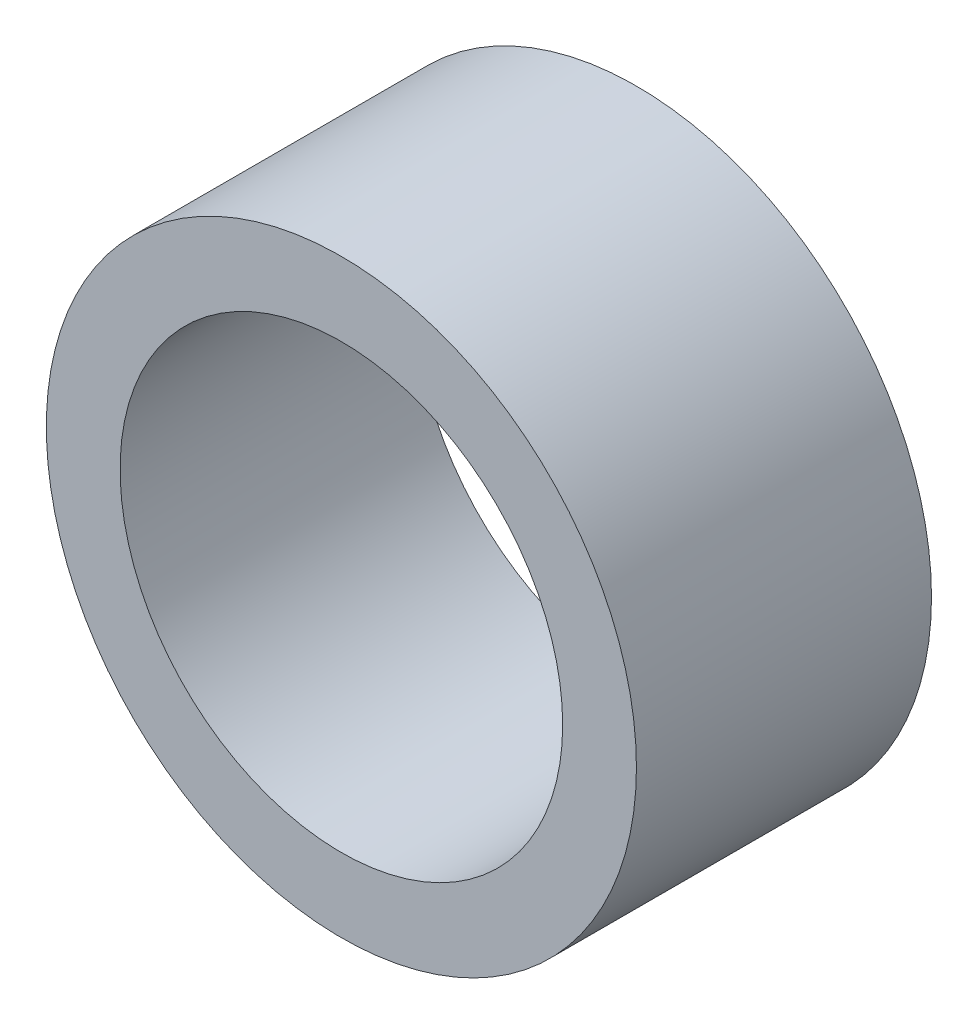
ISO-10303-21;
HEADER;
FILE_DESCRIPTION(('STEP AP214'),'2;1');
FILE_NAME('part.step','',(''),(''),'','','');
FILE_SCHEMA(('AUTOMOTIVE_DESIGN { 1 0 10303 214 1 1 1 1 }'));
ENDSEC;
DATA;
#1=APPLICATION_CONTEXT('core data for automotive mechanical design processes');
#2=APPLICATION_PROTOCOL_DEFINITION('international standard','automotive_design',2000,#1);
#3=PRODUCT_CONTEXT('',#1,'mechanical');
#4=PRODUCT('Part','Part','',(#3));
#5=PRODUCT_RELATED_PRODUCT_CATEGORY('part','',(#4));
#6=PRODUCT_DEFINITION_FORMATION('','',#4);
#7=PRODUCT_DEFINITION_CONTEXT('part definition',#1,'design');
#8=PRODUCT_DEFINITION('design','',#6,#7);
#9=PRODUCT_DEFINITION_SHAPE('','',#8);
#10=(LENGTH_UNIT() NAMED_UNIT(*) SI_UNIT(.MILLI.,.METRE.));
#11=(NAMED_UNIT(*) PLANE_ANGLE_UNIT() SI_UNIT($,.RADIAN.));
#12=(NAMED_UNIT(*) SI_UNIT($,.STERADIAN.) SOLID_ANGLE_UNIT());
#13=UNCERTAINTY_MEASURE_WITH_UNIT(LENGTH_MEASURE(1.E-05),#10,'distance_accuracy_value','');
#14=(GEOMETRIC_REPRESENTATION_CONTEXT(3) GLOBAL_UNCERTAINTY_ASSIGNED_CONTEXT((#13)) GLOBAL_UNIT_ASSIGNED_CONTEXT((#10,
#11,#12)) REPRESENTATION_CONTEXT('',''));
#15=CARTESIAN_POINT('',(0.,0.,0.));
#16=DIRECTION('',(0.,0.,1.));
#17=DIRECTION('',(1.,0.,0.));
#18=AXIS2_PLACEMENT_3D('',#15,#16,#17);
#19=CARTESIAN_POINT('',(0.,0.,40.));
#20=DIRECTION('',(0.,0.,1.));
#21=DIRECTION('',(1.,0.,0.));
#22=AXIS2_PLACEMENT_3D('',#19,#20,#21);
#23=PLANE('',#22);
#24=CARTESIAN_POINT('',(0.,0.,40.));
#25=DIRECTION('',(0.,0.,1.));
#26=DIRECTION('',(1.,0.,0.));
#27=AXIS2_PLACEMENT_3D('',#24,#25,#26);
#28=CIRCLE('',#27,40.);
#29=CARTESIAN_POINT('',(40.,0.,40.));
#30=VERTEX_POINT('',#29);
#31=EDGE_CURVE('E10',#30,#30,#28,.T.);
#32=ORIENTED_EDGE('',*,*,#31,.T.);
#33=EDGE_LOOP('',(#32));
#34=FACE_BOUND('',#33,.T.);
#35=CARTESIAN_POINT('',(0.,0.,40.));
#36=DIRECTION('',(0.,0.,1.));
#37=DIRECTION('',(1.,0.,0.));
#38=AXIS2_PLACEMENT_3D('',#35,#36,#37);
#39=CIRCLE('',#38,30.);
#40=CARTESIAN_POINT('',(30.,0.,40.));
#41=VERTEX_POINT('',#40);
#42=EDGE_CURVE('E41',#41,#41,#39,.T.);
#43=ORIENTED_EDGE('',*,*,#42,.F.);
#44=EDGE_LOOP('',(#43));
#45=FACE_BOUND('',#44,.T.);
#46=ADVANCED_FACE('F30',(#34,#45),#23,.T.);
#47=CARTESIAN_POINT('',(0.,0.,0.));
#48=DIRECTION('',(0.,0.,1.));
#49=DIRECTION('',(1.,0.,0.));
#50=AXIS2_PLACEMENT_3D('',#47,#48,#49);
#51=PLANE('',#50);
#52=CARTESIAN_POINT('',(0.,0.,0.));
#53=DIRECTION('',(0.,0.,1.));
#54=DIRECTION('',(1.,0.,0.));
#55=AXIS2_PLACEMENT_3D('',#52,#53,#54);
#56=CIRCLE('',#55,40.);
#57=CARTESIAN_POINT('',(40.,0.,0.));
#58=VERTEX_POINT('',#57);
#59=EDGE_CURVE('E34',#58,#58,#56,.T.);
#60=ORIENTED_EDGE('',*,*,#59,.F.);
#61=EDGE_LOOP('',(#60));
#62=FACE_BOUND('',#61,.T.);
#63=CARTESIAN_POINT('',(0.,0.,0.));
#64=DIRECTION('',(0.,0.,1.));
#65=DIRECTION('',(1.,0.,0.));
#66=AXIS2_PLACEMENT_3D('',#63,#64,#65);
#67=CIRCLE('',#66,30.);
#68=CARTESIAN_POINT('',(30.,0.,0.));
#69=VERTEX_POINT('',#68);
#70=EDGE_CURVE('E43',#69,#69,#67,.T.);
#71=ORIENTED_EDGE('',*,*,#70,.T.);
#72=EDGE_LOOP('',(#71));
#73=FACE_BOUND('',#72,.T.);
#74=ADVANCED_FACE('F53',(#62,#73),#51,.F.);
#75=CARTESIAN_POINT('',(0.,0.,40.));
#76=DIRECTION('',(0.,0.,-1.));
#77=DIRECTION('',(-1.,0.,0.));
#78=AXIS2_PLACEMENT_3D('',#75,#76,#77);
#79=CYLINDRICAL_SURFACE('',#78,40.);
#80=ORIENTED_EDGE('',*,*,#31,.F.);
#81=EDGE_LOOP('',(#80));
#82=FACE_BOUND('',#81,.T.);
#83=ORIENTED_EDGE('',*,*,#59,.T.);
#84=EDGE_LOOP('',(#83));
#85=FACE_BOUND('',#84,.T.);
#86=ADVANCED_FACE('F32',(#82,#85),#79,.T.);
#87=CARTESIAN_POINT('',(0.,0.,40.));
#88=DIRECTION('',(0.,0.,-1.));
#89=DIRECTION('',(-1.,0.,0.));
#90=AXIS2_PLACEMENT_3D('',#87,#88,#89);
#91=CYLINDRICAL_SURFACE('',#90,30.);
#92=ORIENTED_EDGE('',*,*,#42,.T.);
#93=EDGE_LOOP('',(#92));
#94=FACE_BOUND('',#93,.T.);
#95=ORIENTED_EDGE('',*,*,#70,.F.);
#96=EDGE_LOOP('',(#95));
#97=FACE_BOUND('',#96,.T.);
#98=ADVANCED_FACE('F49',(#94,#97),#91,.F.);
#99=CLOSED_SHELL('',(#46,#74,#86,#98));
#100=MANIFOLD_SOLID_BREP('B2',#99);
#101=ADVANCED_BREP_SHAPE_REPRESENTATION('',(#18,#100),#14);
#102=SHAPE_DEFINITION_REPRESENTATION(#9,#101);
ENDSEC;
END-ISO-10303-21;
